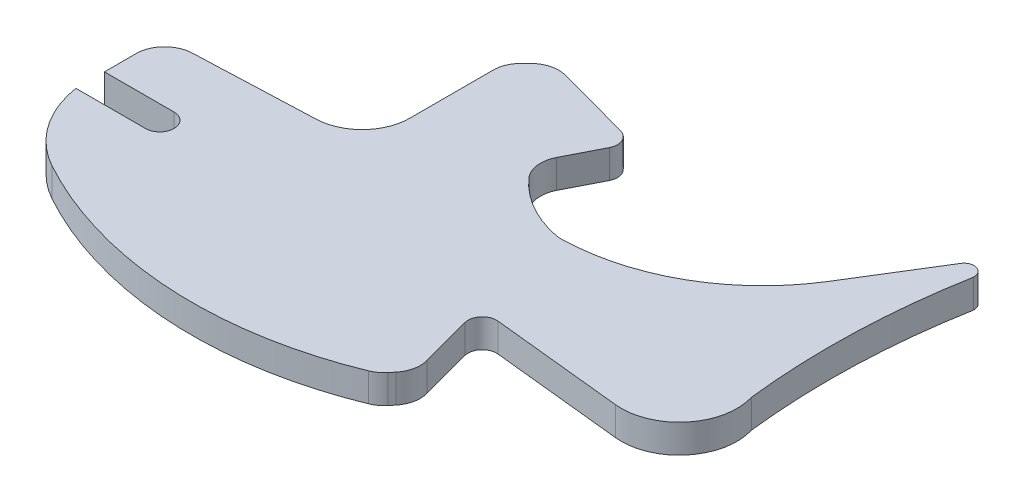
ISO-10303-21;
HEADER;
FILE_DESCRIPTION(('STEP AP214'),'2;1');
FILE_NAME('part.step','',(''),(''),'','','');
FILE_SCHEMA(('AUTOMOTIVE_DESIGN { 1 0 10303 214 1 1 1 1 }'));
ENDSEC;
DATA;
#1=APPLICATION_CONTEXT('core data for automotive mechanical design processes');
#2=APPLICATION_PROTOCOL_DEFINITION('international standard','automotive_design',2000,#1);
#3=PRODUCT_CONTEXT('',#1,'mechanical');
#4=PRODUCT('Part','Part','',(#3));
#5=PRODUCT_RELATED_PRODUCT_CATEGORY('part','',(#4));
#6=PRODUCT_DEFINITION_FORMATION('','',#4);
#7=PRODUCT_DEFINITION_CONTEXT('part definition',#1,'design');
#8=PRODUCT_DEFINITION('design','',#6,#7);
#9=PRODUCT_DEFINITION_SHAPE('','',#8);
#10=(LENGTH_UNIT() NAMED_UNIT(*) SI_UNIT(.MILLI.,.METRE.));
#11=(NAMED_UNIT(*) PLANE_ANGLE_UNIT() SI_UNIT($,.RADIAN.));
#12=(NAMED_UNIT(*) SI_UNIT($,.STERADIAN.) SOLID_ANGLE_UNIT());
#13=UNCERTAINTY_MEASURE_WITH_UNIT(LENGTH_MEASURE(1.E-05),#10,'distance_accuracy_value','');
#14=(GEOMETRIC_REPRESENTATION_CONTEXT(3) GLOBAL_UNCERTAINTY_ASSIGNED_CONTEXT((#13)) GLOBAL_UNIT_ASSIGNED_CONTEXT((#10,
#11,#12)) REPRESENTATION_CONTEXT('',''));
#15=CARTESIAN_POINT('',(0.,0.,0.));
#16=DIRECTION('',(0.,0.,1.));
#17=DIRECTION('',(1.,0.,0.));
#18=AXIS2_PLACEMENT_3D('',#15,#16,#17);
#19=CARTESIAN_POINT('',(22.85,3.,-24.35));
#20=DIRECTION('',(0.697550223632843,0.,0.716535892687709));
#21=DIRECTION('',(0.716535892687709,0.,-0.697550223632843));
#22=AXIS2_PLACEMENT_3D('',#19,#20,#21);
#23=PLANE('',#22);
#24=DIRECTION('',(-0.716535892687709,0.,0.697550223632842));
#25=VECTOR('',#24,1.);
#26=CARTESIAN_POINT('',(22.85,0.,-24.35));
#27=LINE('',#26,#25);
#28=CARTESIAN_POINT('',(21.6248201589076,0.,-23.1572830951443));
#29=VERTEX_POINT('',#28);
#30=CARTESIAN_POINT('',(21.1573493291015,0.,-22.7021985903752));
#31=VERTEX_POINT('',#30);
#32=EDGE_CURVE('E299',#29,#31,#27,.T.);
#33=ORIENTED_EDGE('',*,*,#32,.T.);
#34=DIRECTION('',(0.,-1.,0.));
#35=VECTOR('',#34,1.);
#36=CARTESIAN_POINT('',(21.1573493291015,3.,-22.7021985903752));
#37=LINE('',#36,#35);
#38=CARTESIAN_POINT('',(21.1573493291015,3.,-22.7021985903752));
#39=VERTEX_POINT('',#38);
#40=EDGE_CURVE('E426',#31,#39,#37,.F.);
#41=ORIENTED_EDGE('',*,*,#40,.T.);
#42=DIRECTION('',(-0.716535892687709,0.,0.697550223632842));
#43=VECTOR('',#42,1.);
#44=CARTESIAN_POINT('',(22.85,3.,-24.35));
#45=LINE('',#44,#43);
#46=CARTESIAN_POINT('',(21.6248201589076,3.,-23.1572830951443));
#47=VERTEX_POINT('',#46);
#48=EDGE_CURVE('E346',#47,#39,#45,.T.);
#49=ORIENTED_EDGE('',*,*,#48,.F.);
#50=DIRECTION('',(0.,-1.,0.));
#51=VECTOR('',#50,1.);
#52=CARTESIAN_POINT('',(21.6248201589076,3.,-23.1572830951443));
#53=LINE('',#52,#51);
#54=EDGE_CURVE('E423',#47,#29,#53,.T.);
#55=ORIENTED_EDGE('',*,*,#54,.T.);
#56=EDGE_LOOP('',(#33,#41,#49,#55));
#57=FACE_BOUND('',#56,.T.);
#58=ADVANCED_FACE('F33',(#57),#23,.F.);
#59=CARTESIAN_POINT('',(20.25,3.,-21.8188908120953));
#60=DIRECTION('',(1.,0.,0.));
#61=DIRECTION('',(0.,0.,-1.));
#62=AXIS2_PLACEMENT_3D('',#59,#60,#61);
#63=PLANE('',#62);
#64=DIRECTION('',(0.,0.,1.));
#65=VECTOR('',#64,1.);
#66=CARTESIAN_POINT('',(20.25,0.,-21.8188908120953));
#67=LINE('',#66,#65);
#68=CARTESIAN_POINT('',(20.25,0.,-20.5525909123121));
#69=VERTEX_POINT('',#68);
#70=CARTESIAN_POINT('',(20.25,0.,-11.8099923398344));
#71=VERTEX_POINT('',#70);
#72=EDGE_CURVE('E302',#69,#71,#67,.T.);
#73=ORIENTED_EDGE('',*,*,#72,.T.);
#74=DIRECTION('',(0.,-1.,0.));
#75=VECTOR('',#74,1.);
#76=CARTESIAN_POINT('',(20.25,3.,-11.8099923398344));
#77=LINE('',#76,#75);
#78=CARTESIAN_POINT('',(20.25,3.,-11.8099923398344));
#79=VERTEX_POINT('',#78);
#80=EDGE_CURVE('E54',#71,#79,#77,.F.);
#81=ORIENTED_EDGE('',*,*,#80,.T.);
#82=DIRECTION('',(0.,0.,1.));
#83=VECTOR('',#82,1.);
#84=CARTESIAN_POINT('',(20.25,3.,-21.8188908120953));
#85=LINE('',#84,#83);
#86=CARTESIAN_POINT('',(20.25,3.,-20.5525909123121));
#87=VERTEX_POINT('',#86);
#88=EDGE_CURVE('E260',#87,#79,#85,.T.);
#89=ORIENTED_EDGE('',*,*,#88,.F.);
#90=DIRECTION('',(0.,-1.,0.));
#91=VECTOR('',#90,1.);
#92=CARTESIAN_POINT('',(20.25,3.,-20.5525909123121));
#93=LINE('',#92,#91);
#94=EDGE_CURVE('E420',#87,#69,#93,.T.);
#95=ORIENTED_EDGE('',*,*,#94,.T.);
#96=EDGE_LOOP('',(#73,#81,#89,#95));
#97=FACE_BOUND('',#96,.T.);
#98=ADVANCED_FACE('F473',(#97),#63,.F.);
#99=CARTESIAN_POINT('',(0.,3.,-6.20478921096306));
#100=DIRECTION('',(-0.0394000512282152,0.,-0.999223516518308));
#101=DIRECTION('',(-0.999223516518309,0.,0.0394000512282152));
#102=AXIS2_PLACEMENT_3D('',#99,#100,#101);
#103=PLANE('',#102);
#104=DIRECTION('',(0.999223516518308,0.,-0.0394000512282152));
#105=VECTOR('',#104,1.);
#106=CARTESIAN_POINT('',(0.,3.,-6.20478921096306));
#107=LINE('',#106,#105);
#108=CARTESIAN_POINT('',(2.88179984631535,3.,-6.31842050536045));
#109=VERTEX_POINT('',#108);
#110=CARTESIAN_POINT('',(15.4470002561411,3.,-6.8138747572429));
#111=VERTEX_POINT('',#110);
#112=EDGE_CURVE('E257',#109,#111,#107,.T.);
#113=ORIENTED_EDGE('',*,*,#112,.T.);
#114=DIRECTION('',(0.,-1.,0.));
#115=VECTOR('',#114,1.);
#116=CARTESIAN_POINT('',(15.4470002561411,3.,-6.8138747572429));
#117=LINE('',#116,#115);
#118=CARTESIAN_POINT('',(15.4470002561411,0.,-6.8138747572429));
#119=VERTEX_POINT('',#118);
#120=EDGE_CURVE('E451',#111,#119,#117,.T.);
#121=ORIENTED_EDGE('',*,*,#120,.T.);
#122=DIRECTION('',(0.999223516518308,0.,-0.0394000512282152));
#123=VECTOR('',#122,1.);
#124=CARTESIAN_POINT('',(0.,0.,-6.20478921096306));
#125=LINE('',#124,#123);
#126=CARTESIAN_POINT('',(2.88179984631535,0.,-6.31842050536045));
#127=VERTEX_POINT('',#126);
#128=EDGE_CURVE('E304',#127,#119,#125,.T.);
#129=ORIENTED_EDGE('',*,*,#128,.F.);
#130=DIRECTION('',(0.,-1.,0.));
#131=VECTOR('',#130,1.);
#132=CARTESIAN_POINT('',(2.88179984631535,3.,-6.31842050536045));
#133=LINE('',#132,#131);
#134=EDGE_CURVE('E418',#127,#109,#133,.F.);
#135=ORIENTED_EDGE('',*,*,#134,.T.);
#136=EDGE_LOOP('',(#113,#121,#129,#135));
#137=FACE_BOUND('',#136,.T.);
#138=ADVANCED_FACE('F457',(#137),#103,.T.);
#139=CARTESIAN_POINT('',(0.,3.,0.));
#140=DIRECTION('',(-1.,0.,0.));
#141=DIRECTION('',(0.,0.,1.));
#142=AXIS2_PLACEMENT_3D('',#139,#140,#141);
#143=PLANE('',#142);
#144=DIRECTION('',(0.,0.,-1.));
#145=VECTOR('',#144,1.);
#146=CARTESIAN_POINT('',(0.,3.,0.));
#147=LINE('',#146,#145);
#148=CARTESIAN_POINT('',(0.,3.,0.));
#149=VERTEX_POINT('',#148);
#150=CARTESIAN_POINT('',(0.,3.,-3.32074995580553));
#151=VERTEX_POINT('',#150);
#152=EDGE_CURVE('E235',#149,#151,#147,.T.);
#153=ORIENTED_EDGE('',*,*,#152,.T.);
#154=DIRECTION('',(0.,-1.,0.));
#155=VECTOR('',#154,1.);
#156=CARTESIAN_POINT('',(0.,3.,-3.32074995580553));
#157=LINE('',#156,#155);
#158=CARTESIAN_POINT('',(0.,0.,-3.32074995580553));
#159=VERTEX_POINT('',#158);
#160=EDGE_CURVE('E416',#151,#159,#157,.T.);
#161=ORIENTED_EDGE('',*,*,#160,.T.);
#162=DIRECTION('',(0.,0.,-1.));
#163=VECTOR('',#162,1.);
#164=CARTESIAN_POINT('',(0.,0.,0.));
#165=LINE('',#164,#163);
#166=CARTESIAN_POINT('',(0.,0.,0.));
#167=VERTEX_POINT('',#166);
#168=EDGE_CURVE('E238',#167,#159,#165,.T.);
#169=ORIENTED_EDGE('',*,*,#168,.F.);
#170=DIRECTION('',(0.,-1.,0.));
#171=VECTOR('',#170,1.);
#172=CARTESIAN_POINT('',(0.,3.,0.));
#173=LINE('',#172,#171);
#174=EDGE_CURVE('E230',#149,#167,#173,.T.);
#175=ORIENTED_EDGE('',*,*,#174,.F.);
#176=EDGE_LOOP('',(#153,#161,#169,#175));
#177=FACE_BOUND('',#176,.T.);
#178=ADVANCED_FACE('F232',(#177),#143,.T.);
#179=CARTESIAN_POINT('',(0.,3.,0.));
#180=DIRECTION('',(0.,0.,-1.));
#181=DIRECTION('',(-1.,0.,0.));
#182=AXIS2_PLACEMENT_3D('',#179,#180,#181);
#183=PLANE('',#182);
#184=DIRECTION('',(1.,0.,0.));
#185=VECTOR('',#184,1.);
#186=CARTESIAN_POINT('',(0.,0.,0.));
#187=LINE('',#186,#185);
#188=CARTESIAN_POINT('',(7.31,0.,0.));
#189=VERTEX_POINT('',#188);
#190=EDGE_CURVE('E307',#167,#189,#187,.T.);
#191=ORIENTED_EDGE('',*,*,#190,.T.);
#192=DIRECTION('',(0.,-1.,0.));
#193=VECTOR('',#192,1.);
#194=CARTESIAN_POINT('',(7.31,3.,0.));
#195=LINE('',#194,#193);
#196=CARTESIAN_POINT('',(7.31,3.,0.));
#197=VERTEX_POINT('',#196);
#198=EDGE_CURVE('E242',#197,#189,#195,.T.);
#199=ORIENTED_EDGE('',*,*,#198,.F.);
#200=DIRECTION('',(1.,0.,0.));
#201=VECTOR('',#200,1.);
#202=CARTESIAN_POINT('',(0.,3.,0.));
#203=LINE('',#202,#201);
#204=EDGE_CURVE('E245',#149,#197,#203,.T.);
#205=ORIENTED_EDGE('',*,*,#204,.F.);
#206=ORIENTED_EDGE('',*,*,#174,.T.);
#207=EDGE_LOOP('',(#191,#199,#205,#206));
#208=FACE_BOUND('',#207,.T.);
#209=ADVANCED_FACE('F246',(#208),#183,.F.);
#210=CARTESIAN_POINT('',(7.31,3.,1.5));
#211=DIRECTION('',(0.,-1.,0.));
#212=DIRECTION('',(0.,0.,-1.));
#213=AXIS2_PLACEMENT_3D('',#210,#211,#212);
#214=CYLINDRICAL_SURFACE('',#213,1.5);
#215=CARTESIAN_POINT('',(7.31,0.,1.5));
#216=DIRECTION('',(0.,-1.,0.));
#217=DIRECTION('',(0.,0.,-1.));
#218=AXIS2_PLACEMENT_3D('',#215,#216,#217);
#219=CIRCLE('',#218,1.5);
#220=CARTESIAN_POINT('',(7.31,0.,3.));
#221=VERTEX_POINT('',#220);
#222=EDGE_CURVE('E309',#189,#221,#219,.T.);
#223=ORIENTED_EDGE('',*,*,#222,.T.);
#224=DIRECTION('',(0.,-1.,0.));
#225=VECTOR('',#224,1.);
#226=CARTESIAN_POINT('',(7.31,3.,3.));
#227=LINE('',#226,#225);
#228=CARTESIAN_POINT('',(7.31,3.,3.));
#229=VERTEX_POINT('',#228);
#230=EDGE_CURVE('E365',#229,#221,#227,.T.);
#231=ORIENTED_EDGE('',*,*,#230,.F.);
#232=CARTESIAN_POINT('',(7.31,3.,1.5));
#233=DIRECTION('',(0.,-1.,0.));
#234=DIRECTION('',(0.,0.,-1.));
#235=AXIS2_PLACEMENT_3D('',#232,#233,#234);
#236=CIRCLE('',#235,1.5);
#237=EDGE_CURVE('E250',#197,#229,#236,.T.);
#238=ORIENTED_EDGE('',*,*,#237,.F.);
#239=ORIENTED_EDGE('',*,*,#198,.T.);
#240=EDGE_LOOP('',(#223,#231,#238,#239));
#241=FACE_BOUND('',#240,.T.);
#242=ADVANCED_FACE('F604',(#241),#214,.F.);
#243=CARTESIAN_POINT('',(7.31,3.,3.));
#244=DIRECTION('',(0.,0.,1.));
#245=DIRECTION('',(1.,0.,0.));
#246=AXIS2_PLACEMENT_3D('',#243,#244,#245);
#247=PLANE('',#246);
#248=DIRECTION('',(-1.,0.,0.));
#249=VECTOR('',#248,1.);
#250=CARTESIAN_POINT('',(7.31,0.,3.));
#251=LINE('',#250,#249);
#252=CARTESIAN_POINT('',(0.,0.,3.));
#253=VERTEX_POINT('',#252);
#254=EDGE_CURVE('E311',#221,#253,#251,.T.);
#255=ORIENTED_EDGE('',*,*,#254,.T.);
#256=DIRECTION('',(0.,-1.,0.));
#257=VECTOR('',#256,1.);
#258=CARTESIAN_POINT('',(0.,3.,3.));
#259=LINE('',#258,#257);
#260=CARTESIAN_POINT('',(0.,3.,3.));
#261=VERTEX_POINT('',#260);
#262=EDGE_CURVE('E362',#261,#253,#259,.T.);
#263=ORIENTED_EDGE('',*,*,#262,.F.);
#264=DIRECTION('',(-1.,0.,0.));
#265=VECTOR('',#264,1.);
#266=CARTESIAN_POINT('',(7.31,3.,3.));
#267=LINE('',#266,#265);
#268=EDGE_CURVE('E265',#229,#261,#267,.T.);
#269=ORIENTED_EDGE('',*,*,#268,.F.);
#270=ORIENTED_EDGE('',*,*,#230,.T.);
#271=EDGE_LOOP('',(#255,#263,#269,#270));
#272=FACE_BOUND('',#271,.T.);
#273=ADVANCED_FACE('F600',(#272),#247,.F.);
#274=CARTESIAN_POINT('',(11.3442791515744,3.,1.25795472695896));
#275=DIRECTION('',(0.,-1.,0.));
#276=DIRECTION('',(0.,0.,-1.));
#277=AXIS2_PLACEMENT_3D('',#274,#275,#276);
#278=CYLINDRICAL_SURFACE('',#277,11.477255386292);
#279=CARTESIAN_POINT('',(11.3442791515744,0.,1.25795472695896));
#280=DIRECTION('',(0.,1.,0.));
#281=DIRECTION('',(0.,0.,1.));
#282=AXIS2_PLACEMENT_3D('',#279,#280,#281);
#283=CIRCLE('',#282,11.477255386292);
#284=CARTESIAN_POINT('',(5.82351061345718,0.,11.3201863855278));
#285=VERTEX_POINT('',#284);
#286=EDGE_CURVE('E313',#253,#285,#283,.T.);
#287=ORIENTED_EDGE('',*,*,#286,.T.);
#288=DIRECTION('',(0.,-1.,0.));
#289=VECTOR('',#288,1.);
#290=CARTESIAN_POINT('',(5.82351061345718,3.,11.3201863855278));
#291=LINE('',#290,#289);
#292=CARTESIAN_POINT('',(5.82351061345718,3.,11.3201863855278));
#293=VERTEX_POINT('',#292);
#294=EDGE_CURVE('E359',#293,#285,#291,.T.);
#295=ORIENTED_EDGE('',*,*,#294,.F.);
#296=CARTESIAN_POINT('',(11.3442791515744,3.,1.25795472695896));
#297=DIRECTION('',(0.,1.,0.));
#298=DIRECTION('',(0.,0.,1.));
#299=AXIS2_PLACEMENT_3D('',#296,#297,#298);
#300=CIRCLE('',#299,11.477255386292);
#301=EDGE_CURVE('E267',#261,#293,#300,.T.);
#302=ORIENTED_EDGE('',*,*,#301,.F.);
#303=ORIENTED_EDGE('',*,*,#262,.T.);
#304=EDGE_LOOP('',(#287,#295,#302,#303));
#305=FACE_BOUND('',#304,.T.);
#306=ADVANCED_FACE('F595',(#305),#278,.T.);
#307=CARTESIAN_POINT('',(25.5510634561132,3.,-24.6355334366188));
#308=DIRECTION('',(0.,-1.,0.));
#309=DIRECTION('',(0.,0.,-1.));
#310=AXIS2_PLACEMENT_3D('',#307,#308,#309);
#311=CYLINDRICAL_SURFACE('',#310,41.0120729674628);
#312=CARTESIAN_POINT('',(25.5510634561132,0.,-24.6355334366188));
#313=DIRECTION('',(0.,-1.,0.));
#314=DIRECTION('',(0.,0.,-1.));
#315=AXIS2_PLACEMENT_3D('',#312,#313,#314);
#316=CIRCLE('',#315,41.0120729674628);
#317=CARTESIAN_POINT('',(41.0676886104882,0.,13.3279289042572));
#318=VERTEX_POINT('',#317);
#319=EDGE_CURVE('E316',#318,#285,#316,.T.);
#320=ORIENTED_EDGE('',*,*,#319,.F.);
#321=DIRECTION('',(0.,-1.,0.));
#322=VECTOR('',#321,1.);
#323=CARTESIAN_POINT('',(41.0676886104882,3.,13.3279289042572));
#324=LINE('',#323,#322);
#325=CARTESIAN_POINT('',(41.0676886104882,3.,13.3279289042572));
#326=VERTEX_POINT('',#325);
#327=EDGE_CURVE('E402',#318,#326,#324,.F.);
#328=ORIENTED_EDGE('',*,*,#327,.T.);
#329=CARTESIAN_POINT('',(25.5510634561132,3.,-24.6355334366188));
#330=DIRECTION('',(0.,-1.,0.));
#331=DIRECTION('',(0.,0.,-1.));
#332=AXIS2_PLACEMENT_3D('',#329,#330,#331);
#333=CIRCLE('',#332,41.0120729674628);
#334=EDGE_CURVE('E270',#326,#293,#333,.T.);
#335=ORIENTED_EDGE('',*,*,#334,.T.);
#336=ORIENTED_EDGE('',*,*,#294,.T.);
#337=EDGE_LOOP('',(#320,#328,#335,#336));
#338=FACE_BOUND('',#337,.T.);
#339=ADVANCED_FACE('F591',(#338),#311,.T.);
#340=CARTESIAN_POINT('',(-32.6907229408461,3.,-49.5473072205358));
#341=DIRECTION('',(0.,-1.,0.));
#342=DIRECTION('',(0.,0.,-1.));
#343=AXIS2_PLACEMENT_3D('',#340,#341,#342);
#344=CYLINDRICAL_SURFACE('',#343,97.2653390532713);
#345=CARTESIAN_POINT('',(-32.6907229408461,3.,-49.5473072205358));
#346=DIRECTION('',(0.,1.,0.));
#347=DIRECTION('',(0.,0.,1.));
#348=AXIS2_PLACEMENT_3D('',#345,#346,#347);
#349=CIRCLE('',#348,97.2653390532713);
#350=CARTESIAN_POINT('',(42.2439034829476,3.,12.463562341778));
#351=VERTEX_POINT('',#350);
#352=CARTESIAN_POINT('',(42.6207904466965,3.,12.0052892513094));
#353=VERTEX_POINT('',#352);
#354=EDGE_CURVE('E272',#351,#353,#349,.T.);
#355=ORIENTED_EDGE('',*,*,#354,.F.);
#356=DIRECTION('',(0.,-1.,0.));
#357=VECTOR('',#356,1.);
#358=CARTESIAN_POINT('',(42.2439034829476,3.,12.463562341778));
#359=LINE('',#358,#357);
#360=CARTESIAN_POINT('',(42.2439034829476,0.,12.463562341778));
#361=VERTEX_POINT('',#360);
#362=EDGE_CURVE('E388',#351,#361,#359,.T.);
#363=ORIENTED_EDGE('',*,*,#362,.T.);
#364=CARTESIAN_POINT('',(-32.6907229408461,0.,-49.5473072205358));
#365=DIRECTION('',(0.,1.,0.));
#366=DIRECTION('',(0.,0.,1.));
#367=AXIS2_PLACEMENT_3D('',#364,#365,#366);
#368=CIRCLE('',#367,97.2653390532713);
#369=CARTESIAN_POINT('',(42.6207904466965,0.,12.0052892513094));
#370=VERTEX_POINT('',#369);
#371=EDGE_CURVE('E318',#361,#370,#368,.T.);
#372=ORIENTED_EDGE('',*,*,#371,.T.);
#373=DIRECTION('',(0.,-1.,0.));
#374=VECTOR('',#373,1.);
#375=CARTESIAN_POINT('',(42.6207904466965,3.,12.0052892513094));
#376=LINE('',#375,#374);
#377=EDGE_CURVE('E386',#370,#353,#376,.F.);
#378=ORIENTED_EDGE('',*,*,#377,.T.);
#379=EDGE_LOOP('',(#355,#363,#372,#378));
#380=FACE_BOUND('',#379,.T.);
#381=ADVANCED_FACE('F582',(#380),#344,.T.);
#382=CARTESIAN_POINT('',(43.59,3.,10.8));
#383=DIRECTION('',(-0.965842837234668,0.,0.259128566087351));
#384=DIRECTION('',(0.259128566087351,0.,0.965842837234668));
#385=AXIS2_PLACEMENT_3D('',#382,#383,#384);
#386=PLANE('',#385);
#387=DIRECTION('',(-0.259128566087351,0.,-0.965842837234668));
#388=VECTOR('',#387,1.);
#389=CARTESIAN_POINT('',(43.59,3.,10.8));
#390=LINE('',#389,#388);
#391=CARTESIAN_POINT('',(43.1954509936994,3.,9.32940824924335));
#392=VERTEX_POINT('',#391);
#393=CARTESIAN_POINT('',(41.7351034374554,3.,3.88629463051559));
#394=VERTEX_POINT('',#393);
#395=EDGE_CURVE('E275',#392,#394,#390,.T.);
#396=ORIENTED_EDGE('',*,*,#395,.F.);
#397=DIRECTION('',(0.,-1.,0.));
#398=VECTOR('',#397,1.);
#399=CARTESIAN_POINT('',(43.1954509936994,3.,9.32940824924335));
#400=LINE('',#399,#398);
#401=CARTESIAN_POINT('',(43.1954509936994,0.,9.32940824924335));
#402=VERTEX_POINT('',#401);
#403=EDGE_CURVE('E413',#392,#402,#400,.T.);
#404=ORIENTED_EDGE('',*,*,#403,.T.);
#405=DIRECTION('',(-0.259128566087351,0.,-0.965842837234668));
#406=VECTOR('',#405,1.);
#407=CARTESIAN_POINT('',(43.59,0.,10.8));
#408=LINE('',#407,#406);
#409=CARTESIAN_POINT('',(41.7351034374554,0.,3.88629463051559));
#410=VERTEX_POINT('',#409);
#411=EDGE_CURVE('E321',#402,#410,#408,.T.);
#412=ORIENTED_EDGE('',*,*,#411,.T.);
#413=DIRECTION('',(0.,-1.,0.));
#414=VECTOR('',#413,1.);
#415=CARTESIAN_POINT('',(41.7351034374554,3.,3.88629463051559));
#416=LINE('',#415,#414);
#417=EDGE_CURVE('E371',#410,#394,#416,.F.);
#418=ORIENTED_EDGE('',*,*,#417,.T.);
#419=EDGE_LOOP('',(#396,#404,#412,#418));
#420=FACE_BOUND('',#419,.T.);
#421=ADVANCED_FACE('F576',(#420),#386,.F.);
#422=CARTESIAN_POINT('',(41.17,3.,1.78));
#423=DIRECTION('',(0.103473553983147,0.,-0.994632205202555));
#424=DIRECTION('',(-0.994632205202555,0.,-0.103473553983147));
#425=AXIS2_PLACEMENT_3D('',#422,#423,#424);
#426=PLANE('',#425);
#427=DIRECTION('',(0.994632205202555,0.,0.103473553983147));
#428=VECTOR('',#427,1.);
#429=CARTESIAN_POINT('',(41.17,3.,1.78));
#430=LINE('',#429,#428);
#431=CARTESIAN_POINT('',(43.3390780242821,3.,2.00565347358073));
#432=VERTEX_POINT('',#431);
#433=CARTESIAN_POINT('',(57.1266323671955,3.,3.44));
#434=VERTEX_POINT('',#433);
#435=EDGE_CURVE('E277',#432,#434,#430,.T.);
#436=ORIENTED_EDGE('',*,*,#435,.F.);
#437=DIRECTION('',(0.,-1.,0.));
#438=VECTOR('',#437,1.);
#439=CARTESIAN_POINT('',(43.3390780242821,0.,2.00565347358073));
#440=LINE('',#439,#438);
#441=CARTESIAN_POINT('',(43.3390780242821,0.,2.00565347358073));
#442=VERTEX_POINT('',#441);
#443=EDGE_CURVE('E241',#432,#442,#440,.T.);
#444=ORIENTED_EDGE('',*,*,#443,.T.);
#445=DIRECTION('',(0.994632205202555,0.,0.103473553983147));
#446=VECTOR('',#445,1.);
#447=CARTESIAN_POINT('',(41.17,0.,1.78));
#448=LINE('',#447,#446);
#449=CARTESIAN_POINT('',(57.1266323671955,0.,3.44));
#450=VERTEX_POINT('',#449);
#451=EDGE_CURVE('E323',#442,#450,#448,.T.);
#452=ORIENTED_EDGE('',*,*,#451,.T.);
#453=DIRECTION('',(0.,-1.,0.));
#454=VECTOR('',#453,1.);
#455=CARTESIAN_POINT('',(57.1266323671955,3.,3.44));
#456=LINE('',#455,#454);
#457=EDGE_CURVE('E356',#434,#450,#456,.T.);
#458=ORIENTED_EDGE('',*,*,#457,.F.);
#459=EDGE_LOOP('',(#436,#444,#452,#458));
#460=FACE_BOUND('',#459,.T.);
#461=ADVANCED_FACE('F571',(#460),#426,.F.);
#462=CARTESIAN_POINT('',(57.7558548480124,3.,-2.60835650817465));
#463=DIRECTION('',(0.,-1.,0.));
#464=DIRECTION('',(0.,0.,-1.));
#465=AXIS2_PLACEMENT_3D('',#462,#463,#464);
#466=CYLINDRICAL_SURFACE('',#465,6.0809980579132);
#467=CARTESIAN_POINT('',(57.7558548480124,0.,-2.60835650817465));
#468=DIRECTION('',(0.,1.,0.));
#469=DIRECTION('',(0.,0.,1.));
#470=AXIS2_PLACEMENT_3D('',#467,#468,#469);
#471=CIRCLE('',#470,6.0809980579132);
#472=CARTESIAN_POINT('',(63.57,0.,-4.39));
#473=VERTEX_POINT('',#472);
#474=EDGE_CURVE('E325',#450,#473,#471,.T.);
#475=ORIENTED_EDGE('',*,*,#474,.T.);
#476=DIRECTION('',(0.,-1.,0.));
#477=VECTOR('',#476,1.);
#478=CARTESIAN_POINT('',(63.57,3.,-4.39));
#479=LINE('',#478,#477);
#480=CARTESIAN_POINT('',(63.57,3.,-4.39));
#481=VERTEX_POINT('',#480);
#482=EDGE_CURVE('E353',#481,#473,#479,.T.);
#483=ORIENTED_EDGE('',*,*,#482,.F.);
#484=CARTESIAN_POINT('',(57.7558548480124,3.,-2.60835650817465));
#485=DIRECTION('',(0.,1.,0.));
#486=DIRECTION('',(0.,0.,1.));
#487=AXIS2_PLACEMENT_3D('',#484,#485,#486);
#488=CIRCLE('',#487,6.0809980579132);
#489=EDGE_CURVE('E279',#434,#481,#488,.T.);
#490=ORIENTED_EDGE('',*,*,#489,.F.);
#491=ORIENTED_EDGE('',*,*,#457,.T.);
#492=EDGE_LOOP('',(#475,#483,#490,#491));
#493=FACE_BOUND('',#492,.T.);
#494=ADVANCED_FACE('F564',(#493),#466,.T.);
#495=CARTESIAN_POINT('',(140.580735629446,3.,-13.1556893832567));
#496=DIRECTION('',(0.,-1.,0.));
#497=DIRECTION('',(0.,0.,-1.));
#498=AXIS2_PLACEMENT_3D('',#495,#496,#497);
#499=CYLINDRICAL_SURFACE('',#498,77.5080041837756);
#500=CARTESIAN_POINT('',(140.580735629446,0.,-13.1556893832567));
#501=DIRECTION('',(0.,-1.,0.));
#502=DIRECTION('',(0.,0.,-1.));
#503=AXIS2_PLACEMENT_3D('',#500,#501,#502);
#504=CIRCLE('',#503,77.5080041837756);
#505=CARTESIAN_POINT('',(64.3156829499567,0.,-26.9807554715934));
#506=VERTEX_POINT('',#505);
#507=EDGE_CURVE('E327',#473,#506,#504,.T.);
#508=ORIENTED_EDGE('',*,*,#507,.T.);
#509=DIRECTION('',(0.,-1.,0.));
#510=VECTOR('',#509,1.);
#511=CARTESIAN_POINT('',(64.3156829499567,3.,-26.9807554715934));
#512=LINE('',#511,#510);
#513=CARTESIAN_POINT('',(64.3156829499567,3.,-26.9807554715934));
#514=VERTEX_POINT('',#513);
#515=EDGE_CURVE('E350',#514,#506,#512,.T.);
#516=ORIENTED_EDGE('',*,*,#515,.F.);
#517=CARTESIAN_POINT('',(140.580735629446,3.,-13.1556893832567));
#518=DIRECTION('',(0.,-1.,0.));
#519=DIRECTION('',(0.,0.,-1.));
#520=AXIS2_PLACEMENT_3D('',#517,#518,#519);
#521=CIRCLE('',#520,77.5080041837756);
#522=EDGE_CURVE('E281',#481,#514,#521,.T.);
#523=ORIENTED_EDGE('',*,*,#522,.F.);
#524=ORIENTED_EDGE('',*,*,#482,.T.);
#525=EDGE_LOOP('',(#508,#516,#523,#524));
#526=FACE_BOUND('',#525,.T.);
#527=ADVANCED_FACE('F560',(#526),#499,.F.);
#528=CARTESIAN_POINT('',(63.275508797788,3.,-27.0021547574427));
#529=DIRECTION('',(0.,-1.,0.));
#530=DIRECTION('',(0.,0.,-1.));
#531=AXIS2_PLACEMENT_3D('',#528,#529,#530);
#532=CYLINDRICAL_SURFACE('',#531,1.04039425040441);
#533=CARTESIAN_POINT('',(63.275508797788,0.,-27.0021547574427));
#534=DIRECTION('',(0.,1.,0.));
#535=DIRECTION('',(0.,0.,1.));
#536=AXIS2_PLACEMENT_3D('',#533,#534,#535);
#537=CIRCLE('',#536,1.04039425040441);
#538=CARTESIAN_POINT('',(62.3903961498444,0.,-27.5489598385499));
#539=VERTEX_POINT('',#538);
#540=EDGE_CURVE('E329',#506,#539,#537,.T.);
#541=ORIENTED_EDGE('',*,*,#540,.T.);
#542=DIRECTION('',(0.,-1.,0.));
#543=VECTOR('',#542,1.);
#544=CARTESIAN_POINT('',(62.3903961498444,3.,-27.5489598385499));
#545=LINE('',#544,#543);
#546=CARTESIAN_POINT('',(62.3903961498444,3.,-27.5489598385499));
#547=VERTEX_POINT('',#546);
#548=EDGE_CURVE('E348',#547,#539,#545,.T.);
#549=ORIENTED_EDGE('',*,*,#548,.F.);
#550=CARTESIAN_POINT('',(63.275508797788,3.,-27.0021547574427));
#551=DIRECTION('',(0.,1.,0.));
#552=DIRECTION('',(0.,0.,1.));
#553=AXIS2_PLACEMENT_3D('',#550,#551,#552);
#554=CIRCLE('',#553,1.04039425040441);
#555=EDGE_CURVE('E283',#514,#547,#554,.T.);
#556=ORIENTED_EDGE('',*,*,#555,.F.);
#557=ORIENTED_EDGE('',*,*,#515,.T.);
#558=EDGE_LOOP('',(#541,#549,#556,#557));
#559=FACE_BOUND('',#558,.T.);
#560=ADVANCED_FACE('F555',(#559),#532,.T.);
#561=CARTESIAN_POINT('',(57.1266323671955,3.,-19.0285124967358));
#562=DIRECTION('',(-0.850747346594464,0.,-0.525574877883712));
#563=DIRECTION('',(-0.525574877883712,0.,0.850747346594464));
#564=AXIS2_PLACEMENT_3D('',#561,#562,#563);
#565=PLANE('',#564);
#566=DIRECTION('',(0.525574877883712,0.,-0.850747346594464));
#567=VECTOR('',#566,1.);
#568=CARTESIAN_POINT('',(57.1266323671955,0.,-19.0285124967358));
#569=LINE('',#568,#567);
#570=CARTESIAN_POINT('',(57.1266323671955,0.,-19.0285124967358));
#571=VERTEX_POINT('',#570);
#572=EDGE_CURVE('E332',#571,#539,#569,.T.);
#573=ORIENTED_EDGE('',*,*,#572,.F.);
#574=DIRECTION('',(0.,-1.,0.));
#575=VECTOR('',#574,1.);
#576=CARTESIAN_POINT('',(57.1266323671955,3.,-19.0285124967358));
#577=LINE('',#576,#575);
#578=CARTESIAN_POINT('',(57.1266323671955,3.,-19.0285124967358));
#579=VERTEX_POINT('',#578);
#580=EDGE_CURVE('E298',#579,#571,#577,.T.);
#581=ORIENTED_EDGE('',*,*,#580,.F.);
#582=DIRECTION('',(0.525574877883712,0.,-0.850747346594464));
#583=VECTOR('',#582,1.);
#584=CARTESIAN_POINT('',(57.1266323671955,3.,-19.0285124967358));
#585=LINE('',#584,#583);
#586=EDGE_CURVE('E285',#579,#547,#585,.T.);
#587=ORIENTED_EDGE('',*,*,#586,.T.);
#588=ORIENTED_EDGE('',*,*,#548,.T.);
#589=EDGE_LOOP('',(#573,#581,#587,#588));
#590=FACE_BOUND('',#589,.T.);
#591=ADVANCED_FACE('F549',(#590),#565,.T.);
#592=CARTESIAN_POINT('',(38.747985170873,3.,-30.3824770956752));
#593=DIRECTION('',(0.,-1.,0.));
#594=DIRECTION('',(0.,0.,-1.));
#595=AXIS2_PLACEMENT_3D('',#592,#593,#594);
#596=CYLINDRICAL_SURFACE('',#595,21.6029438938507);
#597=CARTESIAN_POINT('',(38.747985170873,0.,-30.3824770956752));
#598=DIRECTION('',(0.,-1.,0.));
#599=DIRECTION('',(0.,0.,-1.));
#600=AXIS2_PLACEMENT_3D('',#597,#598,#599);
#601=CIRCLE('',#600,21.6029438938507);
#602=CARTESIAN_POINT('',(39.2082763600237,0.,-8.78443744152941));
#603=VERTEX_POINT('',#602);
#604=EDGE_CURVE('E335',#571,#603,#601,.T.);
#605=ORIENTED_EDGE('',*,*,#604,.T.);
#606=DIRECTION('',(0.,-1.,0.));
#607=VECTOR('',#606,1.);
#608=CARTESIAN_POINT('',(39.2082763600237,3.,-8.78443744152941));
#609=LINE('',#608,#607);
#610=CARTESIAN_POINT('',(39.2082763600237,3.,-8.78443744152941));
#611=VERTEX_POINT('',#610);
#612=EDGE_CURVE('E384',#603,#611,#609,.F.);
#613=ORIENTED_EDGE('',*,*,#612,.T.);
#614=CARTESIAN_POINT('',(38.747985170873,3.,-30.3824770956752));
#615=DIRECTION('',(0.,-1.,0.));
#616=DIRECTION('',(0.,0.,-1.));
#617=AXIS2_PLACEMENT_3D('',#614,#615,#616);
#618=CIRCLE('',#617,21.6029438938507);
#619=EDGE_CURVE('E288',#579,#611,#618,.T.);
#620=ORIENTED_EDGE('',*,*,#619,.F.);
#621=ORIENTED_EDGE('',*,*,#580,.T.);
#622=EDGE_LOOP('',(#605,#613,#620,#621));
#623=FACE_BOUND('',#622,.T.);
#624=ADVANCED_FACE('F545',(#623),#596,.F.);
#625=CARTESIAN_POINT('',(40.9177493374095,3.,-20.6313552561949));
#626=DIRECTION('',(0.,-1.,0.));
#627=DIRECTION('',(0.,0.,-1.));
#628=AXIS2_PLACEMENT_3D('',#625,#626,#627);
#629=CYLINDRICAL_SURFACE('',#628,12.0235763724402);
#630=CARTESIAN_POINT('',(40.9177493374095,3.,-20.6313552561949));
#631=DIRECTION('',(0.,-1.,0.));
#632=DIRECTION('',(0.,0.,-1.));
#633=AXIS2_PLACEMENT_3D('',#630,#631,#632);
#634=CIRCLE('',#633,12.0235763724402);
#635=CARTESIAN_POINT('',(38.5547690204645,3.,-8.84226229678391));
#636=VERTEX_POINT('',#635);
#637=CARTESIAN_POINT('',(31.9742690615803,3.,-12.5951528359122));
#638=VERTEX_POINT('',#637);
#639=EDGE_CURVE('E291',#636,#638,#634,.T.);
#640=ORIENTED_EDGE('',*,*,#639,.F.);
#641=DIRECTION('',(0.,-1.,0.));
#642=VECTOR('',#641,1.);
#643=CARTESIAN_POINT('',(38.5547690204645,3.,-8.84226229678391));
#644=LINE('',#643,#642);
#645=CARTESIAN_POINT('',(38.5547690204645,0.,-8.84226229678391));
#646=VERTEX_POINT('',#645);
#647=EDGE_CURVE('E381',#636,#646,#644,.T.);
#648=ORIENTED_EDGE('',*,*,#647,.T.);
#649=CARTESIAN_POINT('',(40.9177493374095,0.,-20.6313552561949));
#650=DIRECTION('',(0.,-1.,0.));
#651=DIRECTION('',(0.,0.,-1.));
#652=AXIS2_PLACEMENT_3D('',#649,#650,#651);
#653=CIRCLE('',#652,12.0235763724402);
#654=CARTESIAN_POINT('',(31.9742690615803,0.,-12.5951528359122));
#655=VERTEX_POINT('',#654);
#656=EDGE_CURVE('E338',#646,#655,#653,.T.);
#657=ORIENTED_EDGE('',*,*,#656,.T.);
#658=DIRECTION('',(0.,-1.,0.));
#659=VECTOR('',#658,1.);
#660=CARTESIAN_POINT('',(31.9742690615803,3.,-12.5951528359122));
#661=LINE('',#660,#659);
#662=EDGE_CURVE('E379',#655,#638,#661,.F.);
#663=ORIENTED_EDGE('',*,*,#662,.T.);
#664=EDGE_LOOP('',(#640,#648,#657,#663));
#665=FACE_BOUND('',#664,.T.);
#666=ADVANCED_FACE('F538',(#665),#629,.F.);
#667=CARTESIAN_POINT('',(30.69,3.,-14.31));
#668=DIRECTION('',(-0.890814734889464,0.,-0.454366711042758));
#669=DIRECTION('',(-0.454366711042758,0.,0.890814734889464));
#670=AXIS2_PLACEMENT_3D('',#667,#668,#669);
#671=PLANE('',#670);
#672=DIRECTION('',(0.454366711042758,0.,-0.890814734889464));
#673=VECTOR('',#672,1.);
#674=CARTESIAN_POINT('',(30.69,0.,-14.31));
#675=LINE('',#674,#673);
#676=CARTESIAN_POINT('',(31.5333107306979,0.,-15.9633641368049));
#677=VERTEX_POINT('',#676);
#678=CARTESIAN_POINT('',(33.3999670058772,0.,-19.6230620734944));
#679=VERTEX_POINT('',#678);
#680=EDGE_CURVE('E341',#677,#679,#675,.T.);
#681=ORIENTED_EDGE('',*,*,#680,.T.);
#682=DIRECTION('',(0.,-1.,0.));
#683=VECTOR('',#682,1.);
#684=CARTESIAN_POINT('',(33.3999670058772,3.,-19.6230620734944));
#685=LINE('',#684,#683);
#686=CARTESIAN_POINT('',(33.3999670058772,3.,-19.6230620734944));
#687=VERTEX_POINT('',#686);
#688=EDGE_CURVE('E447',#679,#687,#685,.F.);
#689=ORIENTED_EDGE('',*,*,#688,.T.);
#690=DIRECTION('',(0.454366711042758,0.,-0.890814734889464));
#691=VECTOR('',#690,1.);
#692=CARTESIAN_POINT('',(30.69,3.,-14.31));
#693=LINE('',#692,#691);
#694=CARTESIAN_POINT('',(31.5333107306979,3.,-15.9633641368049));
#695=VERTEX_POINT('',#694);
#696=EDGE_CURVE('E294',#695,#687,#693,.T.);
#697=ORIENTED_EDGE('',*,*,#696,.F.);
#698=DIRECTION('',(0.,1.,0.));
#699=VECTOR('',#698,1.);
#700=CARTESIAN_POINT('',(31.5333107306979,0.,-15.9633641368049));
#701=LINE('',#700,#699);
#702=EDGE_CURVE('E431',#695,#677,#701,.F.);
#703=ORIENTED_EDGE('',*,*,#702,.T.);
#704=EDGE_LOOP('',(#681,#689,#697,#703));
#705=FACE_BOUND('',#704,.T.);
#706=ADVANCED_FACE('F519',(#705),#671,.F.);
#707=CARTESIAN_POINT('',(34.24,3.,-21.27));
#708=DIRECTION('',(-0.261037103254758,0.,0.965328768205094));
#709=DIRECTION('',(0.965328768205095,0.,0.261037103254758));
#710=AXIS2_PLACEMENT_3D('',#707,#708,#709);
#711=PLANE('',#710);
#712=DIRECTION('',(-0.965328768205095,0.,-0.261037103254758));
#713=VECTOR('',#712,1.);
#714=CARTESIAN_POINT('',(34.24,3.,-21.27));
#715=LINE('',#714,#713);
#716=CARTESIAN_POINT('',(32.4553005584251,3.,-21.7526052923662));
#717=VERTEX_POINT('',#716);
#718=CARTESIAN_POINT('',(24.5005821395704,3.,-23.9036617216965));
#719=VERTEX_POINT('',#718);
#720=EDGE_CURVE('E296',#717,#719,#715,.T.);
#721=ORIENTED_EDGE('',*,*,#720,.F.);
#722=DIRECTION('',(0.,-1.,0.));
#723=VECTOR('',#722,1.);
#724=CARTESIAN_POINT('',(32.4553005584251,3.,-21.7526052923662));
#725=LINE('',#724,#723);
#726=CARTESIAN_POINT('',(32.4553005584251,0.,-21.7526052923662));
#727=VERTEX_POINT('',#726);
#728=EDGE_CURVE('E442',#717,#727,#725,.T.);
#729=ORIENTED_EDGE('',*,*,#728,.T.);
#730=DIRECTION('',(-0.965328768205095,0.,-0.261037103254758));
#731=VECTOR('',#730,1.);
#732=CARTESIAN_POINT('',(34.24,0.,-21.27));
#733=LINE('',#732,#731);
#734=CARTESIAN_POINT('',(24.5005821395704,0.,-23.9036617216965));
#735=VERTEX_POINT('',#734);
#736=EDGE_CURVE('E344',#727,#735,#733,.T.);
#737=ORIENTED_EDGE('',*,*,#736,.T.);
#738=DIRECTION('',(0.,-1.,0.));
#739=VECTOR('',#738,1.);
#740=CARTESIAN_POINT('',(24.5005821395704,3.,-23.9036617216965));
#741=LINE('',#740,#739);
#742=EDGE_CURVE('E428',#735,#719,#741,.F.);
#743=ORIENTED_EDGE('',*,*,#742,.T.);
#744=EDGE_LOOP('',(#721,#729,#737,#743));
#745=FACE_BOUND('',#744,.T.);
#746=ADVANCED_FACE('F525',(#745),#711,.F.);
#747=CARTESIAN_POINT('',(7.31,3.,1.5));
#748=DIRECTION('',(0.,-1.,0.));
#749=DIRECTION('',(0.,0.,-1.));
#750=AXIS2_PLACEMENT_3D('',#747,#748,#749);
#751=PLANE('',#750);
#752=ORIENTED_EDGE('',*,*,#696,.T.);
#753=CARTESIAN_POINT('',(32.063744903543,3.,-20.3046121400585));
#754=DIRECTION('',(0.,-1.,0.));
#755=DIRECTION('',(0.,0.,-1.));
#756=AXIS2_PLACEMENT_3D('',#753,#754,#755);
#757=CIRCLE('',#756,1.5);
#758=EDGE_CURVE('E449',#687,#717,#757,.F.);
#759=ORIENTED_EDGE('',*,*,#758,.T.);
#760=ORIENTED_EDGE('',*,*,#720,.T.);
#761=CARTESIAN_POINT('',(23.7174708298061,3.,-21.0076754170812));
#762=DIRECTION('',(0.,-1.,0.));
#763=DIRECTION('',(0.,0.,-1.));
#764=AXIS2_PLACEMENT_3D('',#761,#762,#763);
#765=CIRCLE('',#764,3.);
#766=EDGE_CURVE('E404',#719,#47,#765,.F.);
#767=ORIENTED_EDGE('',*,*,#766,.T.);
#768=ORIENTED_EDGE('',*,*,#48,.T.);
#769=CARTESIAN_POINT('',(23.25,3.,-20.5525909123121));
#770=DIRECTION('',(0.,-1.,0.));
#771=DIRECTION('',(0.,0.,-1.));
#772=AXIS2_PLACEMENT_3D('',#769,#770,#771);
#773=CIRCLE('',#772,3.);
#774=EDGE_CURVE('E406',#39,#87,#773,.F.);
#775=ORIENTED_EDGE('',*,*,#774,.T.);
#776=ORIENTED_EDGE('',*,*,#88,.T.);
#777=CARTESIAN_POINT('',(15.25,3.,-11.8099923398344));
#778=DIRECTION('',(0.,-1.,0.));
#779=DIRECTION('',(0.,0.,-1.));
#780=AXIS2_PLACEMENT_3D('',#777,#778,#779);
#781=CIRCLE('',#780,5.);
#782=EDGE_CURVE('E11',#79,#111,#781,.T.);
#783=ORIENTED_EDGE('',*,*,#782,.T.);
#784=ORIENTED_EDGE('',*,*,#112,.F.);
#785=CARTESIAN_POINT('',(3.,3.,-3.32074995580553));
#786=DIRECTION('',(0.,-1.,0.));
#787=DIRECTION('',(0.,0.,-1.));
#788=AXIS2_PLACEMENT_3D('',#785,#786,#787);
#789=CIRCLE('',#788,3.);
#790=EDGE_CURVE('E256',#109,#151,#789,.F.);
#791=ORIENTED_EDGE('',*,*,#790,.T.);
#792=ORIENTED_EDGE('',*,*,#152,.F.);
#793=ORIENTED_EDGE('',*,*,#204,.T.);
#794=ORIENTED_EDGE('',*,*,#237,.T.);
#795=ORIENTED_EDGE('',*,*,#268,.T.);
#796=ORIENTED_EDGE('',*,*,#301,.T.);
#797=ORIENTED_EDGE('',*,*,#334,.F.);
#798=CARTESIAN_POINT('',(39.9326600178088,3.,10.5509323083284));
#799=DIRECTION('',(0.,-1.,0.));
#800=DIRECTION('',(0.,0.,-1.));
#801=AXIS2_PLACEMENT_3D('',#798,#799,#800);
#802=CIRCLE('',#801,3.);
#803=EDGE_CURVE('E411',#326,#351,#802,.F.);
#804=ORIENTED_EDGE('',*,*,#803,.T.);
#805=ORIENTED_EDGE('',*,*,#354,.T.);
#806=CARTESIAN_POINT('',(40.2979224819954,3.,10.1067939475054));
#807=DIRECTION('',(0.,-1.,0.));
#808=DIRECTION('',(0.,0.,-1.));
#809=AXIS2_PLACEMENT_3D('',#806,#807,#808);
#810=CIRCLE('',#809,3.);
#811=EDGE_CURVE('E409',#353,#392,#810,.F.);
#812=ORIENTED_EDGE('',*,*,#811,.T.);
#813=ORIENTED_EDGE('',*,*,#395,.T.);
#814=CARTESIAN_POINT('',(43.1838676933074,3.,3.49760178138456));
#815=DIRECTION('',(0.,-1.,0.));
#816=DIRECTION('',(0.,0.,-1.));
#817=AXIS2_PLACEMENT_3D('',#814,#815,#816);
#818=CIRCLE('',#817,1.5);
#819=EDGE_CURVE('E377',#394,#432,#818,.T.);
#820=ORIENTED_EDGE('',*,*,#819,.T.);
#821=ORIENTED_EDGE('',*,*,#435,.T.);
#822=ORIENTED_EDGE('',*,*,#489,.T.);
#823=ORIENTED_EDGE('',*,*,#522,.T.);
#824=ORIENTED_EDGE('',*,*,#555,.T.);
#825=ORIENTED_EDGE('',*,*,#586,.F.);
#826=ORIENTED_EDGE('',*,*,#619,.T.);
#827=CARTESIAN_POINT('',(39.1443557400269,3.,-11.7837563899474));
#828=DIRECTION('',(0.,-1.,0.));
#829=DIRECTION('',(0.,0.,-1.));
#830=AXIS2_PLACEMENT_3D('',#827,#828,#829);
#831=CIRCLE('',#830,3.);
#832=EDGE_CURVE('E436',#611,#636,#831,.T.);
#833=ORIENTED_EDGE('',*,*,#832,.T.);
#834=ORIENTED_EDGE('',*,*,#639,.T.);
#835=CARTESIAN_POINT('',(34.2057549353663,3.,-14.6002640036766));
#836=DIRECTION('',(0.,-1.,0.));
#837=DIRECTION('',(0.,0.,-1.));
#838=AXIS2_PLACEMENT_3D('',#835,#836,#837);
#839=CIRCLE('',#838,3.);
#840=EDGE_CURVE('E440',#638,#695,#839,.T.);
#841=ORIENTED_EDGE('',*,*,#840,.T.);
#842=EDGE_LOOP('',(#752,#759,#760,#767,#768,#775,#776,#783,#784,#791,#792,#793,#794,#795,#796,
#797,#804,#805,#812,#813,#820,#821,#822,#823,#824,#825,#826,#833,#834,#841));
#843=FACE_BOUND('',#842,.T.);
#844=ADVANCED_FACE('F253',(#843),#751,.F.);
#845=CARTESIAN_POINT('',(7.31,0.,1.5));
#846=DIRECTION('',(0.,-1.,0.));
#847=DIRECTION('',(0.,0.,-1.));
#848=AXIS2_PLACEMENT_3D('',#845,#846,#847);
#849=PLANE('',#848);
#850=ORIENTED_EDGE('',*,*,#736,.F.);
#851=CARTESIAN_POINT('',(32.063744903543,0.,-20.3046121400585));
#852=DIRECTION('',(0.,-1.,0.));
#853=DIRECTION('',(0.,0.,-1.));
#854=AXIS2_PLACEMENT_3D('',#851,#852,#853);
#855=CIRCLE('',#854,1.5);
#856=EDGE_CURVE('E445',#727,#679,#855,.T.);
#857=ORIENTED_EDGE('',*,*,#856,.T.);
#858=ORIENTED_EDGE('',*,*,#680,.F.);
#859=CARTESIAN_POINT('',(34.2057549353663,0.,-14.6002640036766));
#860=DIRECTION('',(0.,-1.,0.));
#861=DIRECTION('',(0.,0.,-1.));
#862=AXIS2_PLACEMENT_3D('',#859,#860,#861);
#863=CIRCLE('',#862,3.);
#864=EDGE_CURVE('E438',#677,#655,#863,.F.);
#865=ORIENTED_EDGE('',*,*,#864,.T.);
#866=ORIENTED_EDGE('',*,*,#656,.F.);
#867=CARTESIAN_POINT('',(39.1443557400269,0.,-11.7837563899474));
#868=DIRECTION('',(0.,-1.,0.));
#869=DIRECTION('',(0.,0.,-1.));
#870=AXIS2_PLACEMENT_3D('',#867,#868,#869);
#871=CIRCLE('',#870,3.);
#872=EDGE_CURVE('E434',#646,#603,#871,.F.);
#873=ORIENTED_EDGE('',*,*,#872,.T.);
#874=ORIENTED_EDGE('',*,*,#604,.F.);
#875=ORIENTED_EDGE('',*,*,#572,.T.);
#876=ORIENTED_EDGE('',*,*,#540,.F.);
#877=ORIENTED_EDGE('',*,*,#507,.F.);
#878=ORIENTED_EDGE('',*,*,#474,.F.);
#879=ORIENTED_EDGE('',*,*,#451,.F.);
#880=CARTESIAN_POINT('',(43.1838676933074,0.,3.49760178138456));
#881=DIRECTION('',(0.,-1.,0.));
#882=DIRECTION('',(0.,0.,-1.));
#883=AXIS2_PLACEMENT_3D('',#880,#881,#882);
#884=CIRCLE('',#883,1.5);
#885=EDGE_CURVE('E374',#442,#410,#884,.F.);
#886=ORIENTED_EDGE('',*,*,#885,.T.);
#887=ORIENTED_EDGE('',*,*,#411,.F.);
#888=CARTESIAN_POINT('',(40.2979224819954,0.,10.1067939475054));
#889=DIRECTION('',(0.,-1.,0.));
#890=DIRECTION('',(0.,0.,-1.));
#891=AXIS2_PLACEMENT_3D('',#888,#889,#890);
#892=CIRCLE('',#891,3.);
#893=EDGE_CURVE('E398',#402,#370,#892,.T.);
#894=ORIENTED_EDGE('',*,*,#893,.T.);
#895=ORIENTED_EDGE('',*,*,#371,.F.);
#896=CARTESIAN_POINT('',(39.9326600178088,0.,10.5509323083284));
#897=DIRECTION('',(0.,-1.,0.));
#898=DIRECTION('',(0.,0.,-1.));
#899=AXIS2_PLACEMENT_3D('',#896,#897,#898);
#900=CIRCLE('',#899,3.);
#901=EDGE_CURVE('E400',#361,#318,#900,.T.);
#902=ORIENTED_EDGE('',*,*,#901,.T.);
#903=ORIENTED_EDGE('',*,*,#319,.T.);
#904=ORIENTED_EDGE('',*,*,#286,.F.);
#905=ORIENTED_EDGE('',*,*,#254,.F.);
#906=ORIENTED_EDGE('',*,*,#222,.F.);
#907=ORIENTED_EDGE('',*,*,#190,.F.);
#908=ORIENTED_EDGE('',*,*,#168,.T.);
#909=CARTESIAN_POINT('',(3.,0.,-3.32074995580553));
#910=DIRECTION('',(0.,-1.,0.));
#911=DIRECTION('',(0.,0.,-1.));
#912=AXIS2_PLACEMENT_3D('',#909,#910,#911);
#913=CIRCLE('',#912,3.);
#914=EDGE_CURVE('E396',#159,#127,#913,.T.);
#915=ORIENTED_EDGE('',*,*,#914,.T.);
#916=ORIENTED_EDGE('',*,*,#128,.T.);
#917=CARTESIAN_POINT('',(15.25,0.,-11.8099923398344));
#918=DIRECTION('',(0.,-1.,0.));
#919=DIRECTION('',(0.,0.,-1.));
#920=AXIS2_PLACEMENT_3D('',#917,#918,#919);
#921=CIRCLE('',#920,5.);
#922=EDGE_CURVE('E41',#119,#71,#921,.F.);
#923=ORIENTED_EDGE('',*,*,#922,.T.);
#924=ORIENTED_EDGE('',*,*,#72,.F.);
#925=CARTESIAN_POINT('',(23.25,0.,-20.5525909123121));
#926=DIRECTION('',(0.,-1.,0.));
#927=DIRECTION('',(0.,0.,-1.));
#928=AXIS2_PLACEMENT_3D('',#925,#926,#927);
#929=CIRCLE('',#928,3.);
#930=EDGE_CURVE('E394',#69,#31,#929,.T.);
#931=ORIENTED_EDGE('',*,*,#930,.T.);
#932=ORIENTED_EDGE('',*,*,#32,.F.);
#933=CARTESIAN_POINT('',(23.7174708298061,0.,-21.0076754170812));
#934=DIRECTION('',(0.,-1.,0.));
#935=DIRECTION('',(0.,0.,-1.));
#936=AXIS2_PLACEMENT_3D('',#933,#934,#935);
#937=CIRCLE('',#936,3.);
#938=EDGE_CURVE('E391',#29,#735,#937,.T.);
#939=ORIENTED_EDGE('',*,*,#938,.T.);
#940=EDGE_LOOP('',(#850,#857,#858,#865,#866,#873,#874,#875,#876,#877,#878,#879,#886,#887,#894,
#895,#902,#903,#904,#905,#906,#907,#908,#915,#916,#923,#924,#931,#932,#939));
#941=FACE_BOUND('',#940,.T.);
#942=ADVANCED_FACE('F462',(#941),#849,.T.);
#943=CARTESIAN_POINT('',(43.1838676933074,3.,3.49760178138456));
#944=DIRECTION('',(0.,1.,0.));
#945=DIRECTION('',(0.,0.,1.));
#946=AXIS2_PLACEMENT_3D('',#943,#944,#945);
#947=CYLINDRICAL_SURFACE('',#946,1.5);
#948=ORIENTED_EDGE('',*,*,#819,.F.);
#949=ORIENTED_EDGE('',*,*,#417,.F.);
#950=ORIENTED_EDGE('',*,*,#885,.F.);
#951=ORIENTED_EDGE('',*,*,#443,.F.);
#952=EDGE_LOOP('',(#948,#949,#950,#951));
#953=FACE_BOUND('',#952,.T.);
#954=ADVANCED_FACE('F482',(#953),#947,.F.);
#955=CARTESIAN_POINT('',(39.1443557400269,3.,-11.7837563899474));
#956=DIRECTION('',(0.,1.,0.));
#957=DIRECTION('',(0.,0.,1.));
#958=AXIS2_PLACEMENT_3D('',#955,#956,#957);
#959=CYLINDRICAL_SURFACE('',#958,3.);
#960=ORIENTED_EDGE('',*,*,#832,.F.);
#961=ORIENTED_EDGE('',*,*,#612,.F.);
#962=ORIENTED_EDGE('',*,*,#872,.F.);
#963=ORIENTED_EDGE('',*,*,#647,.F.);
#964=EDGE_LOOP('',(#960,#961,#962,#963));
#965=FACE_BOUND('',#964,.T.);
#966=ADVANCED_FACE('F485',(#965),#959,.F.);
#967=CARTESIAN_POINT('',(39.9326600178088,3.,10.5509323083284));
#968=DIRECTION('',(0.,-1.,0.));
#969=DIRECTION('',(0.,0.,-1.));
#970=AXIS2_PLACEMENT_3D('',#967,#968,#969);
#971=CYLINDRICAL_SURFACE('',#970,3.);
#972=ORIENTED_EDGE('',*,*,#803,.F.);
#973=ORIENTED_EDGE('',*,*,#327,.F.);
#974=ORIENTED_EDGE('',*,*,#901,.F.);
#975=ORIENTED_EDGE('',*,*,#362,.F.);
#976=EDGE_LOOP('',(#972,#973,#974,#975));
#977=FACE_BOUND('',#976,.T.);
#978=ADVANCED_FACE('F489',(#977),#971,.T.);
#979=CARTESIAN_POINT('',(40.2979224819954,3.,10.1067939475054));
#980=DIRECTION('',(0.,-1.,0.));
#981=DIRECTION('',(0.,0.,-1.));
#982=AXIS2_PLACEMENT_3D('',#979,#980,#981);
#983=CYLINDRICAL_SURFACE('',#982,3.);
#984=ORIENTED_EDGE('',*,*,#811,.F.);
#985=ORIENTED_EDGE('',*,*,#377,.F.);
#986=ORIENTED_EDGE('',*,*,#893,.F.);
#987=ORIENTED_EDGE('',*,*,#403,.F.);
#988=EDGE_LOOP('',(#984,#985,#986,#987));
#989=FACE_BOUND('',#988,.T.);
#990=ADVANCED_FACE('F493',(#989),#983,.T.);
#991=CARTESIAN_POINT('',(3.,3.,-3.32074995580553));
#992=DIRECTION('',(0.,-1.,0.));
#993=DIRECTION('',(0.,0.,-1.));
#994=AXIS2_PLACEMENT_3D('',#991,#992,#993);
#995=CYLINDRICAL_SURFACE('',#994,3.);
#996=ORIENTED_EDGE('',*,*,#790,.F.);
#997=ORIENTED_EDGE('',*,*,#134,.F.);
#998=ORIENTED_EDGE('',*,*,#914,.F.);
#999=ORIENTED_EDGE('',*,*,#160,.F.);
#1000=EDGE_LOOP('',(#996,#997,#998,#999));
#1001=FACE_BOUND('',#1000,.T.);
#1002=ADVANCED_FACE('F464',(#1001),#995,.T.);
#1003=CARTESIAN_POINT('',(23.25,3.,-20.5525909123121));
#1004=DIRECTION('',(0.,-1.,0.));
#1005=DIRECTION('',(0.,0.,-1.));
#1006=AXIS2_PLACEMENT_3D('',#1003,#1004,#1005);
#1007=CYLINDRICAL_SURFACE('',#1006,3.);
#1008=ORIENTED_EDGE('',*,*,#774,.F.);
#1009=ORIENTED_EDGE('',*,*,#40,.F.);
#1010=ORIENTED_EDGE('',*,*,#930,.F.);
#1011=ORIENTED_EDGE('',*,*,#94,.F.);
#1012=EDGE_LOOP('',(#1008,#1009,#1010,#1011));
#1013=FACE_BOUND('',#1012,.T.);
#1014=ADVANCED_FACE('F500',(#1013),#1007,.T.);
#1015=CARTESIAN_POINT('',(23.7174708298061,3.,-21.0076754170812));
#1016=DIRECTION('',(0.,-1.,0.));
#1017=DIRECTION('',(0.,0.,-1.));
#1018=AXIS2_PLACEMENT_3D('',#1015,#1016,#1017);
#1019=CYLINDRICAL_SURFACE('',#1018,3.);
#1020=ORIENTED_EDGE('',*,*,#766,.F.);
#1021=ORIENTED_EDGE('',*,*,#742,.F.);
#1022=ORIENTED_EDGE('',*,*,#938,.F.);
#1023=ORIENTED_EDGE('',*,*,#54,.F.);
#1024=EDGE_LOOP('',(#1020,#1021,#1022,#1023));
#1025=FACE_BOUND('',#1024,.T.);
#1026=ADVANCED_FACE('F503',(#1025),#1019,.T.);
#1027=CARTESIAN_POINT('',(34.2057549353663,3.,-14.6002640036766));
#1028=DIRECTION('',(0.,-1.,0.));
#1029=DIRECTION('',(0.,0.,-1.));
#1030=AXIS2_PLACEMENT_3D('',#1027,#1028,#1029);
#1031=CYLINDRICAL_SURFACE('',#1030,3.);
#1032=ORIENTED_EDGE('',*,*,#840,.F.);
#1033=ORIENTED_EDGE('',*,*,#662,.F.);
#1034=ORIENTED_EDGE('',*,*,#864,.F.);
#1035=ORIENTED_EDGE('',*,*,#702,.F.);
#1036=EDGE_LOOP('',(#1032,#1033,#1034,#1035));
#1037=FACE_BOUND('',#1036,.T.);
#1038=ADVANCED_FACE('F470',(#1037),#1031,.F.);
#1039=CARTESIAN_POINT('',(32.063744903543,3.,-20.3046121400585));
#1040=DIRECTION('',(0.,-1.,0.));
#1041=DIRECTION('',(0.,0.,-1.));
#1042=AXIS2_PLACEMENT_3D('',#1039,#1040,#1041);
#1043=CYLINDRICAL_SURFACE('',#1042,1.5);
#1044=ORIENTED_EDGE('',*,*,#758,.F.);
#1045=ORIENTED_EDGE('',*,*,#688,.F.);
#1046=ORIENTED_EDGE('',*,*,#856,.F.);
#1047=ORIENTED_EDGE('',*,*,#728,.F.);
#1048=EDGE_LOOP('',(#1044,#1045,#1046,#1047));
#1049=FACE_BOUND('',#1048,.T.);
#1050=ADVANCED_FACE('F466',(#1049),#1043,.T.);
#1051=CARTESIAN_POINT('',(15.25,3.,-11.8099923398344));
#1052=DIRECTION('',(0.,-1.,0.));
#1053=DIRECTION('',(0.,0.,-1.));
#1054=AXIS2_PLACEMENT_3D('',#1051,#1052,#1053);
#1055=CYLINDRICAL_SURFACE('',#1054,5.);
#1056=ORIENTED_EDGE('',*,*,#782,.F.);
#1057=ORIENTED_EDGE('',*,*,#80,.F.);
#1058=ORIENTED_EDGE('',*,*,#922,.F.);
#1059=ORIENTED_EDGE('',*,*,#120,.F.);
#1060=EDGE_LOOP('',(#1056,#1057,#1058,#1059));
#1061=FACE_BOUND('',#1060,.T.);
#1062=ADVANCED_FACE('F35',(#1061),#1055,.F.);
#1063=CLOSED_SHELL('',(#58,#98,#138,#178,#209,#242,#273,#306,#339,#381,#421,#461,#494,#527,#560,
#591,#624,#666,#706,#746,#844,#942,#954,#966,#978,#990,#1002,#1014,#1026,#1038,#1050,#1062));
#1064=MANIFOLD_SOLID_BREP('B2',#1063);
#1065=ADVANCED_BREP_SHAPE_REPRESENTATION('',(#18,#1064),#14);
#1066=SHAPE_DEFINITION_REPRESENTATION(#9,#1065);
ENDSEC;
END-ISO-10303-21;
